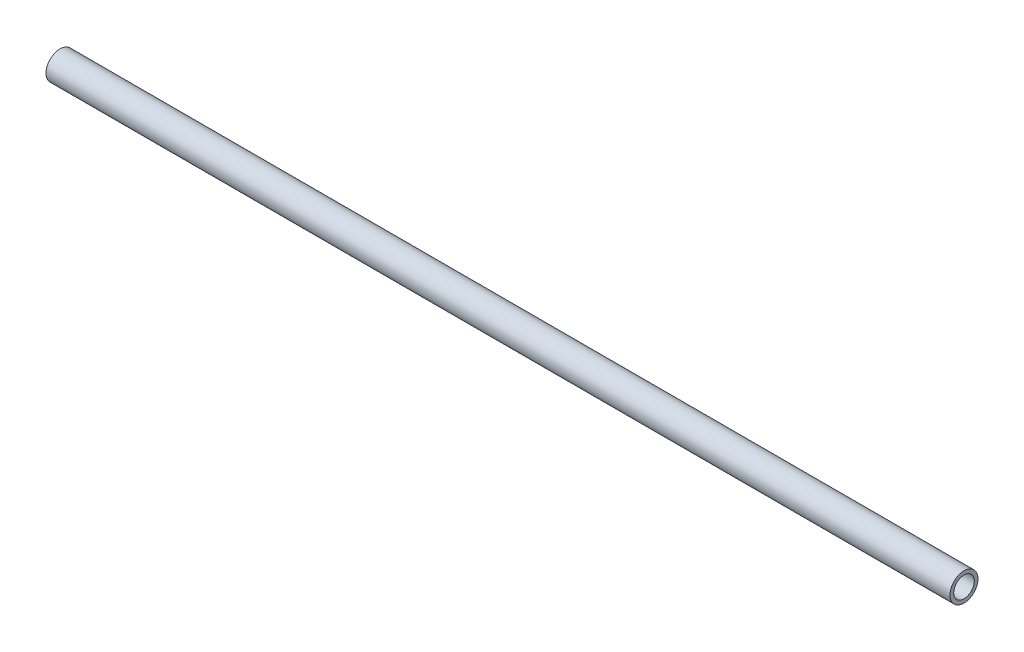
ISO-10303-21;
HEADER;
FILE_DESCRIPTION(('STEP AP214'),'2;1');
FILE_NAME('part.step','',(''),(''),'','','');
FILE_SCHEMA(('AUTOMOTIVE_DESIGN { 1 0 10303 214 1 1 1 1 }'));
ENDSEC;
DATA;
#1=APPLICATION_CONTEXT('core data for automotive mechanical design processes');
#2=APPLICATION_PROTOCOL_DEFINITION('international standard','automotive_design',2000,#1);
#3=PRODUCT_CONTEXT('',#1,'mechanical');
#4=PRODUCT('Part','Part','',(#3));
#5=PRODUCT_RELATED_PRODUCT_CATEGORY('part','',(#4));
#6=PRODUCT_DEFINITION_FORMATION('','',#4);
#7=PRODUCT_DEFINITION_CONTEXT('part definition',#1,'design');
#8=PRODUCT_DEFINITION('design','',#6,#7);
#9=PRODUCT_DEFINITION_SHAPE('','',#8);
#10=(LENGTH_UNIT() NAMED_UNIT(*) SI_UNIT(.MILLI.,.METRE.));
#11=(NAMED_UNIT(*) PLANE_ANGLE_UNIT() SI_UNIT($,.RADIAN.));
#12=(NAMED_UNIT(*) SI_UNIT($,.STERADIAN.) SOLID_ANGLE_UNIT());
#13=UNCERTAINTY_MEASURE_WITH_UNIT(LENGTH_MEASURE(1.E-05),#10,'distance_accuracy_value','');
#14=(GEOMETRIC_REPRESENTATION_CONTEXT(3) GLOBAL_UNCERTAINTY_ASSIGNED_CONTEXT((#13)) GLOBAL_UNIT_ASSIGNED_CONTEXT((#10,
#11,#12)) REPRESENTATION_CONTEXT('',''));
#15=CARTESIAN_POINT('',(0.,0.,0.));
#16=DIRECTION('',(0.,0.,1.));
#17=DIRECTION('',(1.,0.,0.));
#18=AXIS2_PLACEMENT_3D('',#15,#16,#17);
#19=CARTESIAN_POINT('',(13.7,2.25,0.));
#20=DIRECTION('',(1.,0.,0.));
#21=DIRECTION('',(0.,0.,-1.));
#22=AXIS2_PLACEMENT_3D('',#19,#20,#21);
#23=PLANE('',#22);
#24=CARTESIAN_POINT('',(13.7,0.,0.));
#25=DIRECTION('',(-1.,0.,0.));
#26=DIRECTION('',(0.,0.,1.));
#27=AXIS2_PLACEMENT_3D('',#24,#25,#26);
#28=CIRCLE('',#27,1.65);
#29=CARTESIAN_POINT('',(13.7,0.,1.65));
#30=VERTEX_POINT('',#29);
#31=EDGE_CURVE('E10',#30,#30,#28,.T.);
#32=ORIENTED_EDGE('',*,*,#31,.F.);
#33=EDGE_LOOP('',(#32));
#34=FACE_BOUND('',#33,.T.);
#35=CARTESIAN_POINT('',(13.7,0.,0.));
#36=DIRECTION('',(-1.,0.,0.));
#37=DIRECTION('',(0.,0.,1.));
#38=AXIS2_PLACEMENT_3D('',#35,#36,#37);
#39=CIRCLE('',#38,2.25);
#40=CARTESIAN_POINT('',(13.7,0.,2.25));
#41=VERTEX_POINT('',#40);
#42=EDGE_CURVE('E54',#41,#41,#39,.T.);
#43=ORIENTED_EDGE('',*,*,#42,.T.);
#44=EDGE_LOOP('',(#43));
#45=FACE_BOUND('',#44,.T.);
#46=ADVANCED_FACE('F37',(#34,#45),#23,.F.);
#47=CARTESIAN_POINT('',(-110.,0.,0.));
#48=DIRECTION('',(-1.,0.,0.));
#49=DIRECTION('',(0.,0.,1.));
#50=AXIS2_PLACEMENT_3D('',#47,#48,#49);
#51=CYLINDRICAL_SURFACE('',#50,1.65);
#52=CARTESIAN_POINT('',(158.7,0.,0.));
#53=DIRECTION('',(-1.,0.,0.));
#54=DIRECTION('',(0.,0.,1.));
#55=AXIS2_PLACEMENT_3D('',#52,#53,#54);
#56=CIRCLE('',#55,1.65);
#57=CARTESIAN_POINT('',(158.7,0.,1.65));
#58=VERTEX_POINT('',#57);
#59=EDGE_CURVE('E44',#58,#58,#56,.T.);
#60=ORIENTED_EDGE('',*,*,#59,.F.);
#61=EDGE_LOOP('',(#60));
#62=FACE_BOUND('',#61,.T.);
#63=ORIENTED_EDGE('',*,*,#31,.T.);
#64=EDGE_LOOP('',(#63));
#65=FACE_BOUND('',#64,.T.);
#66=ADVANCED_FACE('F70',(#62,#65),#51,.F.);
#67=CARTESIAN_POINT('',(158.7,1.65,0.));
#68=DIRECTION('',(-1.,0.,0.));
#69=DIRECTION('',(0.,0.,1.));
#70=AXIS2_PLACEMENT_3D('',#67,#68,#69);
#71=PLANE('',#70);
#72=CARTESIAN_POINT('',(158.7,0.,0.));
#73=DIRECTION('',(-1.,0.,0.));
#74=DIRECTION('',(0.,0.,1.));
#75=AXIS2_PLACEMENT_3D('',#72,#73,#74);
#76=CIRCLE('',#75,2.25);
#77=CARTESIAN_POINT('',(158.7,0.,2.25));
#78=VERTEX_POINT('',#77);
#79=EDGE_CURVE('E49',#78,#78,#76,.T.);
#80=ORIENTED_EDGE('',*,*,#79,.F.);
#81=EDGE_LOOP('',(#80));
#82=FACE_BOUND('',#81,.T.);
#83=ORIENTED_EDGE('',*,*,#59,.T.);
#84=EDGE_LOOP('',(#83));
#85=FACE_BOUND('',#84,.T.);
#86=ADVANCED_FACE('F65',(#82,#85),#71,.F.);
#87=CARTESIAN_POINT('',(-110.,0.,0.));
#88=DIRECTION('',(-1.,0.,0.));
#89=DIRECTION('',(0.,0.,1.));
#90=AXIS2_PLACEMENT_3D('',#87,#88,#89);
#91=CYLINDRICAL_SURFACE('',#90,2.25);
#92=ORIENTED_EDGE('',*,*,#42,.F.);
#93=EDGE_LOOP('',(#92));
#94=FACE_BOUND('',#93,.T.);
#95=ORIENTED_EDGE('',*,*,#79,.T.);
#96=EDGE_LOOP('',(#95));
#97=FACE_BOUND('',#96,.T.);
#98=ADVANCED_FACE('F62',(#94,#97),#91,.T.);
#99=CLOSED_SHELL('',(#46,#66,#86,#98));
#100=MANIFOLD_SOLID_BREP('B2',#99);
#101=ADVANCED_BREP_SHAPE_REPRESENTATION('',(#18,#100),#14);
#102=SHAPE_DEFINITION_REPRESENTATION(#9,#101);
ENDSEC;
END-ISO-10303-21;
